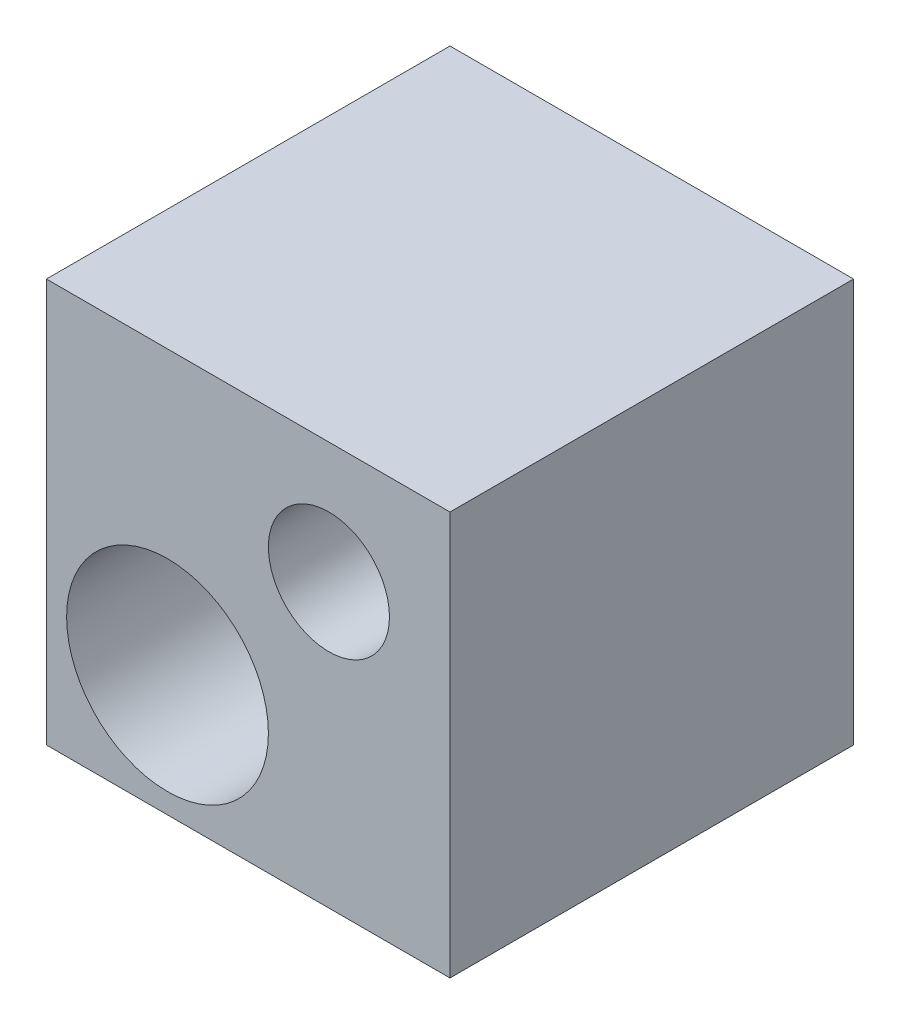
ISO-10303-21;
HEADER;
FILE_DESCRIPTION(('STEP AP214'),'2;1');
FILE_NAME('part.step','',(''),(''),'','','');
FILE_SCHEMA(('AUTOMOTIVE_DESIGN { 1 0 10303 214 1 1 1 1 }'));
ENDSEC;
DATA;
#1=APPLICATION_CONTEXT('core data for automotive mechanical design processes');
#2=APPLICATION_PROTOCOL_DEFINITION('international standard','automotive_design',2000,#1);
#3=PRODUCT_CONTEXT('',#1,'mechanical');
#4=PRODUCT('Part','Part','',(#3));
#5=PRODUCT_RELATED_PRODUCT_CATEGORY('part','',(#4));
#6=PRODUCT_DEFINITION_FORMATION('','',#4);
#7=PRODUCT_DEFINITION_CONTEXT('part definition',#1,'design');
#8=PRODUCT_DEFINITION('design','',#6,#7);
#9=PRODUCT_DEFINITION_SHAPE('','',#8);
#10=(LENGTH_UNIT() NAMED_UNIT(*) SI_UNIT(.MILLI.,.METRE.));
#11=(NAMED_UNIT(*) PLANE_ANGLE_UNIT() SI_UNIT($,.RADIAN.));
#12=(NAMED_UNIT(*) SI_UNIT($,.STERADIAN.) SOLID_ANGLE_UNIT());
#13=UNCERTAINTY_MEASURE_WITH_UNIT(LENGTH_MEASURE(1.E-05),#10,'distance_accuracy_value','');
#14=(GEOMETRIC_REPRESENTATION_CONTEXT(3) GLOBAL_UNCERTAINTY_ASSIGNED_CONTEXT((#13)) GLOBAL_UNIT_ASSIGNED_CONTEXT((#10,
#11,#12)) REPRESENTATION_CONTEXT('',''));
#15=CARTESIAN_POINT('',(0.,0.,0.));
#16=DIRECTION('',(0.,0.,1.));
#17=DIRECTION('',(1.,0.,0.));
#18=AXIS2_PLACEMENT_3D('',#15,#16,#17);
#19=CARTESIAN_POINT('',(0.,0.,10.));
#20=DIRECTION('',(1.,0.,0.));
#21=DIRECTION('',(0.,0.,-1.));
#22=AXIS2_PLACEMENT_3D('',#19,#20,#21);
#23=PLANE('',#22);
#24=DIRECTION('',(0.,-1.,0.));
#25=VECTOR('',#24,1.);
#26=CARTESIAN_POINT('',(0.,0.,0.));
#27=LINE('',#26,#25);
#28=CARTESIAN_POINT('',(0.,10.,0.));
#29=VERTEX_POINT('',#28);
#30=CARTESIAN_POINT('',(0.,0.,0.));
#31=VERTEX_POINT('',#30);
#32=EDGE_CURVE('E98',#29,#31,#27,.T.);
#33=ORIENTED_EDGE('',*,*,#32,.T.);
#34=DIRECTION('',(0.,0.,-1.));
#35=VECTOR('',#34,1.);
#36=CARTESIAN_POINT('',(0.,0.,10.));
#37=LINE('',#36,#35);
#38=CARTESIAN_POINT('',(0.,0.,10.));
#39=VERTEX_POINT('',#38);
#40=EDGE_CURVE('E11',#39,#31,#37,.T.);
#41=ORIENTED_EDGE('',*,*,#40,.F.);
#42=DIRECTION('',(0.,-1.,0.));
#43=VECTOR('',#42,1.);
#44=CARTESIAN_POINT('',(0.,0.,10.));
#45=LINE('',#44,#43);
#46=CARTESIAN_POINT('',(0.,10.,10.));
#47=VERTEX_POINT('',#46);
#48=EDGE_CURVE('E86',#47,#39,#45,.T.);
#49=ORIENTED_EDGE('',*,*,#48,.F.);
#50=DIRECTION('',(0.,0.,-1.));
#51=VECTOR('',#50,1.);
#52=CARTESIAN_POINT('',(0.,10.,10.));
#53=LINE('',#52,#51);
#54=EDGE_CURVE('E94',#47,#29,#53,.T.);
#55=ORIENTED_EDGE('',*,*,#54,.T.);
#56=EDGE_LOOP('',(#33,#41,#49,#55));
#57=FACE_BOUND('',#56,.T.);
#58=ADVANCED_FACE('F35',(#57),#23,.F.);
#59=CARTESIAN_POINT('',(0.,0.,10.));
#60=DIRECTION('',(0.,1.,0.));
#61=DIRECTION('',(0.,0.,1.));
#62=AXIS2_PLACEMENT_3D('',#59,#60,#61);
#63=PLANE('',#62);
#64=DIRECTION('',(1.,0.,0.));
#65=VECTOR('',#64,1.);
#66=CARTESIAN_POINT('',(0.,0.,0.));
#67=LINE('',#66,#65);
#68=CARTESIAN_POINT('',(10.,0.,0.));
#69=VERTEX_POINT('',#68);
#70=EDGE_CURVE('E90',#31,#69,#67,.T.);
#71=ORIENTED_EDGE('',*,*,#70,.T.);
#72=DIRECTION('',(0.,0.,-1.));
#73=VECTOR('',#72,1.);
#74=CARTESIAN_POINT('',(10.,0.,10.));
#75=LINE('',#74,#73);
#76=CARTESIAN_POINT('',(10.,0.,10.));
#77=VERTEX_POINT('',#76);
#78=EDGE_CURVE('E43',#77,#69,#75,.T.);
#79=ORIENTED_EDGE('',*,*,#78,.F.);
#80=DIRECTION('',(1.,0.,0.));
#81=VECTOR('',#80,1.);
#82=CARTESIAN_POINT('',(0.,0.,10.));
#83=LINE('',#82,#81);
#84=EDGE_CURVE('E81',#39,#77,#83,.T.);
#85=ORIENTED_EDGE('',*,*,#84,.F.);
#86=ORIENTED_EDGE('',*,*,#40,.T.);
#87=EDGE_LOOP('',(#71,#79,#85,#86));
#88=FACE_BOUND('',#87,.T.);
#89=ADVANCED_FACE('F89',(#88),#63,.F.);
#90=CARTESIAN_POINT('',(10.,0.,10.));
#91=DIRECTION('',(-1.,0.,0.));
#92=DIRECTION('',(0.,0.,1.));
#93=AXIS2_PLACEMENT_3D('',#90,#91,#92);
#94=PLANE('',#93);
#95=DIRECTION('',(0.,1.,0.));
#96=VECTOR('',#95,1.);
#97=CARTESIAN_POINT('',(10.,0.,0.));
#98=LINE('',#97,#96);
#99=CARTESIAN_POINT('',(10.,10.,0.));
#100=VERTEX_POINT('',#99);
#101=EDGE_CURVE('E68',#69,#100,#98,.T.);
#102=ORIENTED_EDGE('',*,*,#101,.T.);
#103=DIRECTION('',(0.,0.,-1.));
#104=VECTOR('',#103,1.);
#105=CARTESIAN_POINT('',(10.,10.,10.));
#106=LINE('',#105,#104);
#107=CARTESIAN_POINT('',(10.,10.,10.));
#108=VERTEX_POINT('',#107);
#109=EDGE_CURVE('E91',#108,#100,#106,.T.);
#110=ORIENTED_EDGE('',*,*,#109,.F.);
#111=DIRECTION('',(0.,1.,0.));
#112=VECTOR('',#111,1.);
#113=CARTESIAN_POINT('',(10.,0.,10.));
#114=LINE('',#113,#112);
#115=EDGE_CURVE('E84',#77,#108,#114,.T.);
#116=ORIENTED_EDGE('',*,*,#115,.F.);
#117=ORIENTED_EDGE('',*,*,#78,.T.);
#118=EDGE_LOOP('',(#102,#110,#116,#117));
#119=FACE_BOUND('',#118,.T.);
#120=ADVANCED_FACE('F92',(#119),#94,.F.);
#121=CARTESIAN_POINT('',(0.,10.,10.));
#122=DIRECTION('',(0.,-1.,0.));
#123=DIRECTION('',(0.,0.,-1.));
#124=AXIS2_PLACEMENT_3D('',#121,#122,#123);
#125=PLANE('',#124);
#126=DIRECTION('',(-1.,0.,0.));
#127=VECTOR('',#126,1.);
#128=CARTESIAN_POINT('',(0.,10.,0.));
#129=LINE('',#128,#127);
#130=EDGE_CURVE('E74',#100,#29,#129,.T.);
#131=ORIENTED_EDGE('',*,*,#130,.T.);
#132=ORIENTED_EDGE('',*,*,#54,.F.);
#133=DIRECTION('',(-1.,0.,0.));
#134=VECTOR('',#133,1.);
#135=CARTESIAN_POINT('',(0.,10.,10.));
#136=LINE('',#135,#134);
#137=EDGE_CURVE('E51',#108,#47,#136,.T.);
#138=ORIENTED_EDGE('',*,*,#137,.F.);
#139=ORIENTED_EDGE('',*,*,#109,.T.);
#140=EDGE_LOOP('',(#131,#132,#138,#139));
#141=FACE_BOUND('',#140,.T.);
#142=ADVANCED_FACE('F106',(#141),#125,.F.);
#143=CARTESIAN_POINT('',(0.,0.,10.));
#144=DIRECTION('',(0.,0.,-1.));
#145=DIRECTION('',(-1.,0.,0.));
#146=AXIS2_PLACEMENT_3D('',#143,#144,#145);
#147=PLANE('',#146);
#148=CARTESIAN_POINT('',(7.,7.,10.));
#149=DIRECTION('',(0.,0.,1.));
#150=DIRECTION('',(1.,0.,0.));
#151=AXIS2_PLACEMENT_3D('',#148,#149,#150);
#152=CIRCLE('',#151,1.5);
#153=CARTESIAN_POINT('',(8.5,7.,10.));
#154=VERTEX_POINT('',#153);
#155=EDGE_CURVE('E115',#154,#154,#152,.T.);
#156=ORIENTED_EDGE('',*,*,#155,.F.);
#157=EDGE_LOOP('',(#156));
#158=FACE_BOUND('',#157,.T.);
#159=CARTESIAN_POINT('',(3.,3.,10.));
#160=DIRECTION('',(0.,0.,1.));
#161=DIRECTION('',(1.,0.,0.));
#162=AXIS2_PLACEMENT_3D('',#159,#160,#161);
#163=CIRCLE('',#162,2.5);
#164=CARTESIAN_POINT('',(5.5,3.,10.));
#165=VERTEX_POINT('',#164);
#166=EDGE_CURVE('E101',#165,#165,#163,.T.);
#167=ORIENTED_EDGE('',*,*,#166,.F.);
#168=EDGE_LOOP('',(#167));
#169=FACE_BOUND('',#168,.T.);
#170=ORIENTED_EDGE('',*,*,#48,.T.);
#171=ORIENTED_EDGE('',*,*,#84,.T.);
#172=ORIENTED_EDGE('',*,*,#115,.T.);
#173=ORIENTED_EDGE('',*,*,#137,.T.);
#174=EDGE_LOOP('',(#170,#171,#172,#173));
#175=FACE_BOUND('',#174,.T.);
#176=ADVANCED_FACE('F82',(#158,#169,#175),#147,.F.);
#177=CARTESIAN_POINT('',(0.,0.,0.));
#178=DIRECTION('',(0.,0.,-1.));
#179=DIRECTION('',(-1.,0.,0.));
#180=AXIS2_PLACEMENT_3D('',#177,#178,#179);
#181=PLANE('',#180);
#182=CARTESIAN_POINT('',(7.,7.,0.));
#183=DIRECTION('',(0.,0.,1.));
#184=DIRECTION('',(1.,0.,0.));
#185=AXIS2_PLACEMENT_3D('',#182,#183,#184);
#186=CIRCLE('',#185,1.5);
#187=CARTESIAN_POINT('',(8.5,7.,0.));
#188=VERTEX_POINT('',#187);
#189=EDGE_CURVE('E118',#188,#188,#186,.T.);
#190=ORIENTED_EDGE('',*,*,#189,.T.);
#191=EDGE_LOOP('',(#190));
#192=FACE_BOUND('',#191,.T.);
#193=CARTESIAN_POINT('',(3.,3.,0.));
#194=DIRECTION('',(0.,0.,1.));
#195=DIRECTION('',(1.,0.,0.));
#196=AXIS2_PLACEMENT_3D('',#193,#194,#195);
#197=CIRCLE('',#196,2.5);
#198=CARTESIAN_POINT('',(5.5,3.,0.));
#199=VERTEX_POINT('',#198);
#200=EDGE_CURVE('E112',#199,#199,#197,.T.);
#201=ORIENTED_EDGE('',*,*,#200,.T.);
#202=EDGE_LOOP('',(#201));
#203=FACE_BOUND('',#202,.T.);
#204=ORIENTED_EDGE('',*,*,#32,.F.);
#205=ORIENTED_EDGE('',*,*,#130,.F.);
#206=ORIENTED_EDGE('',*,*,#101,.F.);
#207=ORIENTED_EDGE('',*,*,#70,.F.);
#208=EDGE_LOOP('',(#204,#205,#206,#207));
#209=FACE_BOUND('',#208,.T.);
#210=ADVANCED_FACE('F109',(#192,#203,#209),#181,.T.);
#211=CARTESIAN_POINT('',(3.,3.,10.));
#212=DIRECTION('',(0.,0.,-1.));
#213=DIRECTION('',(-1.,0.,0.));
#214=AXIS2_PLACEMENT_3D('',#211,#212,#213);
#215=CYLINDRICAL_SURFACE('',#214,2.5);
#216=ORIENTED_EDGE('',*,*,#166,.T.);
#217=EDGE_LOOP('',(#216));
#218=FACE_BOUND('',#217,.T.);
#219=ORIENTED_EDGE('',*,*,#200,.F.);
#220=EDGE_LOOP('',(#219));
#221=FACE_BOUND('',#220,.T.);
#222=ADVANCED_FACE('F132',(#218,#221),#215,.F.);
#223=CARTESIAN_POINT('',(7.,7.,10.));
#224=DIRECTION('',(0.,0.,-1.));
#225=DIRECTION('',(-1.,0.,0.));
#226=AXIS2_PLACEMENT_3D('',#223,#224,#225);
#227=CYLINDRICAL_SURFACE('',#226,1.5);
#228=ORIENTED_EDGE('',*,*,#155,.T.);
#229=EDGE_LOOP('',(#228));
#230=FACE_BOUND('',#229,.T.);
#231=ORIENTED_EDGE('',*,*,#189,.F.);
#232=EDGE_LOOP('',(#231));
#233=FACE_BOUND('',#232,.T.);
#234=ADVANCED_FACE('F124',(#230,#233),#227,.F.);
#235=CLOSED_SHELL('',(#58,#89,#120,#142,#176,#210,#222,#234));
#236=MANIFOLD_SOLID_BREP('B2',#235);
#237=ADVANCED_BREP_SHAPE_REPRESENTATION('',(#18,#236),#14);
#238=SHAPE_DEFINITION_REPRESENTATION(#9,#237);
ENDSEC;
END-ISO-10303-21;
